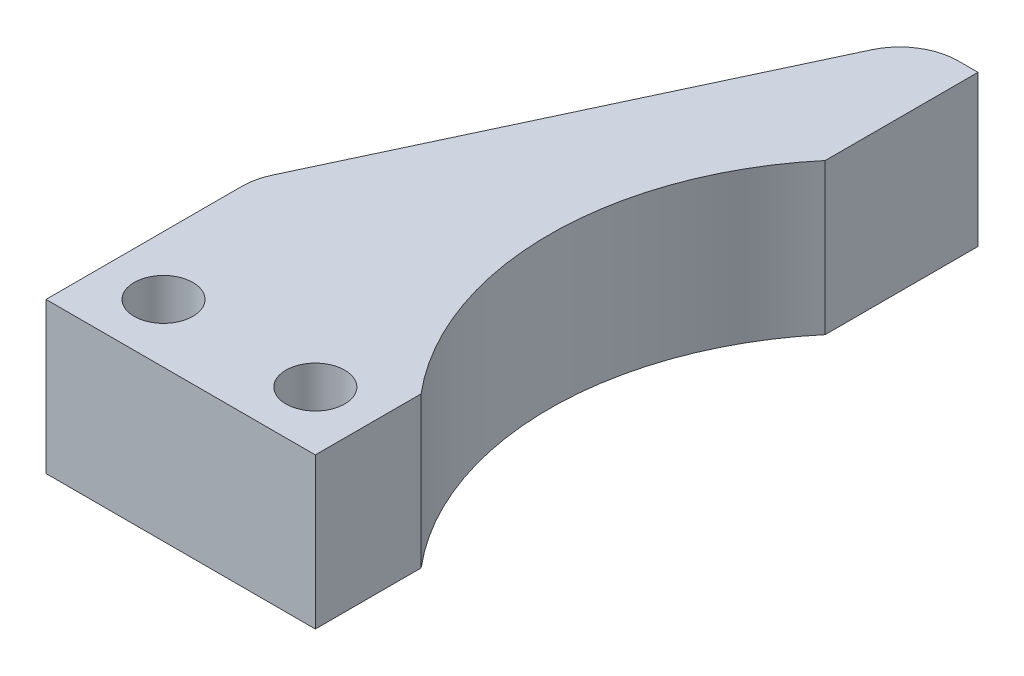
ISO-10303-21;
HEADER;
FILE_DESCRIPTION(('STEP AP214'),'2;1');
FILE_NAME('part.step','',(''),(''),'','','');
FILE_SCHEMA(('AUTOMOTIVE_DESIGN { 1 0 10303 214 1 1 1 1 }'));
ENDSEC;
DATA;
#1=APPLICATION_CONTEXT('core data for automotive mechanical design processes');
#2=APPLICATION_PROTOCOL_DEFINITION('international standard','automotive_design',2000,#1);
#3=PRODUCT_CONTEXT('',#1,'mechanical');
#4=PRODUCT('Part','Part','',(#3));
#5=PRODUCT_RELATED_PRODUCT_CATEGORY('part','',(#4));
#6=PRODUCT_DEFINITION_FORMATION('','',#4);
#7=PRODUCT_DEFINITION_CONTEXT('part definition',#1,'design');
#8=PRODUCT_DEFINITION('design','',#6,#7);
#9=PRODUCT_DEFINITION_SHAPE('','',#8);
#10=(LENGTH_UNIT() NAMED_UNIT(*) SI_UNIT(.MILLI.,.METRE.));
#11=(NAMED_UNIT(*) PLANE_ANGLE_UNIT() SI_UNIT($,.RADIAN.));
#12=(NAMED_UNIT(*) SI_UNIT($,.STERADIAN.) SOLID_ANGLE_UNIT());
#13=UNCERTAINTY_MEASURE_WITH_UNIT(LENGTH_MEASURE(1.E-05),#10,'distance_accuracy_value','');
#14=(GEOMETRIC_REPRESENTATION_CONTEXT(3) GLOBAL_UNCERTAINTY_ASSIGNED_CONTEXT((#13)) GLOBAL_UNIT_ASSIGNED_CONTEXT((#10,
#11,#12)) REPRESENTATION_CONTEXT('',''));
#15=CARTESIAN_POINT('',(0.,0.,0.));
#16=DIRECTION('',(0.,0.,1.));
#17=DIRECTION('',(1.,0.,0.));
#18=AXIS2_PLACEMENT_3D('',#15,#16,#17);
#19=CARTESIAN_POINT('',(-13.3014299379425,3.85,-6.22571671916805));
#20=DIRECTION('',(-0.905702893651664,0.,-0.423913043478261));
#21=DIRECTION('',(-0.423913043478261,0.,0.905702893651664));
#22=AXIS2_PLACEMENT_3D('',#19,#20,#21);
#23=PLANE('',#22);
#24=DIRECTION('',(0.423913043478261,0.,-0.905702893651664));
#25=VECTOR('',#24,1.);
#26=CARTESIAN_POINT('',(-13.3014299379425,-3.85,-6.22571671916805));
#27=LINE('',#26,#25);
#28=CARTESIAN_POINT('',(-13.467108680955,-3.85,-5.87173913043478));
#29=VERTEX_POINT('',#28);
#30=CARTESIAN_POINT('',(-3.71710868095499,-3.85,-26.7029056844231));
#31=VERTEX_POINT('',#30);
#32=EDGE_CURVE('E155',#29,#31,#27,.T.);
#33=ORIENTED_EDGE('',*,*,#32,.F.);
#34=DIRECTION('',(0.,-1.,0.));
#35=VECTOR('',#34,1.);
#36=CARTESIAN_POINT('',(-13.467108680955,3.85,-5.87173913043478));
#37=LINE('',#36,#35);
#38=CARTESIAN_POINT('',(-13.467108680955,3.85,-5.87173913043478));
#39=VERTEX_POINT('',#38);
#40=EDGE_CURVE('E11',#39,#29,#37,.T.);
#41=ORIENTED_EDGE('',*,*,#40,.F.);
#42=DIRECTION('',(0.423913043478261,0.,-0.905702893651664));
#43=VECTOR('',#42,1.);
#44=CARTESIAN_POINT('',(-13.3014299379425,3.85,-6.22571671916805));
#45=LINE('',#44,#43);
#46=CARTESIAN_POINT('',(-3.71710868095499,3.85,-26.7029056844231));
#47=VERTEX_POINT('',#46);
#48=EDGE_CURVE('E193',#39,#47,#45,.T.);
#49=ORIENTED_EDGE('',*,*,#48,.T.);
#50=DIRECTION('',(0.,-1.,0.));
#51=VECTOR('',#50,1.);
#52=CARTESIAN_POINT('',(-3.71710868095499,3.85,-26.7029056844231));
#53=LINE('',#52,#51);
#54=EDGE_CURVE('E60',#47,#31,#53,.T.);
#55=ORIENTED_EDGE('',*,*,#54,.T.);
#56=EDGE_LOOP('',(#33,#41,#49,#55));
#57=FACE_BOUND('',#56,.T.);
#58=ADVANCED_FACE('F43',(#57),#23,.T.);
#59=CARTESIAN_POINT('',(-10.75,3.85,-4.6));
#60=DIRECTION('',(0.,-1.,0.));
#61=DIRECTION('',(0.,0.,-1.));
#62=AXIS2_PLACEMENT_3D('',#59,#60,#61);
#63=CYLINDRICAL_SURFACE('',#62,3.);
#64=CARTESIAN_POINT('',(-10.75,-3.85,-4.6));
#65=DIRECTION('',(0.,1.,0.));
#66=DIRECTION('',(0.,0.,1.));
#67=AXIS2_PLACEMENT_3D('',#64,#65,#66);
#68=CIRCLE('',#67,3.);
#69=CARTESIAN_POINT('',(-13.75,-3.85,-4.6));
#70=VERTEX_POINT('',#69);
#71=EDGE_CURVE('E158',#70,#29,#68,.F.);
#72=ORIENTED_EDGE('',*,*,#71,.F.);
#73=DIRECTION('',(0.,-1.,0.));
#74=VECTOR('',#73,1.);
#75=CARTESIAN_POINT('',(-13.75,3.85,-4.6));
#76=LINE('',#75,#74);
#77=CARTESIAN_POINT('',(-13.75,3.85,-4.6));
#78=VERTEX_POINT('',#77);
#79=EDGE_CURVE('E52',#78,#70,#76,.T.);
#80=ORIENTED_EDGE('',*,*,#79,.F.);
#81=CARTESIAN_POINT('',(-10.75,3.85,-4.6));
#82=DIRECTION('',(0.,1.,0.));
#83=DIRECTION('',(0.,0.,1.));
#84=AXIS2_PLACEMENT_3D('',#81,#82,#83);
#85=CIRCLE('',#84,3.);
#86=EDGE_CURVE('E246',#78,#39,#85,.F.);
#87=ORIENTED_EDGE('',*,*,#86,.T.);
#88=ORIENTED_EDGE('',*,*,#40,.T.);
#89=EDGE_LOOP('',(#72,#80,#87,#88));
#90=FACE_BOUND('',#89,.T.);
#91=ADVANCED_FACE('F221',(#90),#63,.T.);
#92=CARTESIAN_POINT('',(-13.75,3.85,0.));
#93=DIRECTION('',(-1.,0.,0.));
#94=DIRECTION('',(0.,0.,1.));
#95=AXIS2_PLACEMENT_3D('',#92,#93,#94);
#96=PLANE('',#95);
#97=DIRECTION('',(0.,0.,-1.));
#98=VECTOR('',#97,1.);
#99=CARTESIAN_POINT('',(-13.75,-3.85,0.));
#100=LINE('',#99,#98);
#101=CARTESIAN_POINT('',(-13.75,-3.85,5.4));
#102=VERTEX_POINT('',#101);
#103=EDGE_CURVE('E162',#102,#70,#100,.T.);
#104=ORIENTED_EDGE('',*,*,#103,.F.);
#105=DIRECTION('',(0.,-1.,0.));
#106=VECTOR('',#105,1.);
#107=CARTESIAN_POINT('',(-13.75,3.85,5.4));
#108=LINE('',#107,#106);
#109=CARTESIAN_POINT('',(-13.75,3.85,5.4));
#110=VERTEX_POINT('',#109);
#111=EDGE_CURVE('E208',#110,#102,#108,.T.);
#112=ORIENTED_EDGE('',*,*,#111,.F.);
#113=DIRECTION('',(0.,0.,-1.));
#114=VECTOR('',#113,1.);
#115=CARTESIAN_POINT('',(-13.75,3.85,0.));
#116=LINE('',#115,#114);
#117=EDGE_CURVE('E217',#110,#78,#116,.T.);
#118=ORIENTED_EDGE('',*,*,#117,.T.);
#119=ORIENTED_EDGE('',*,*,#79,.T.);
#120=EDGE_LOOP('',(#104,#112,#118,#119));
#121=FACE_BOUND('',#120,.T.);
#122=ADVANCED_FACE('F215',(#121),#96,.T.);
#123=CARTESIAN_POINT('',(0.,3.85,5.4));
#124=DIRECTION('',(0.,0.,-1.));
#125=DIRECTION('',(-1.,0.,0.));
#126=AXIS2_PLACEMENT_3D('',#123,#124,#125);
#127=PLANE('',#126);
#128=DIRECTION('',(1.,0.,0.));
#129=VECTOR('',#128,1.);
#130=CARTESIAN_POINT('',(0.,-3.85,5.4));
#131=LINE('',#130,#129);
#132=CARTESIAN_POINT('',(0.,-3.85,5.4));
#133=VERTEX_POINT('',#132);
#134=EDGE_CURVE('E166',#102,#133,#131,.T.);
#135=ORIENTED_EDGE('',*,*,#134,.T.);
#136=DIRECTION('',(0.,-1.,0.));
#137=VECTOR('',#136,1.);
#138=CARTESIAN_POINT('',(0.,3.85,5.4));
#139=LINE('',#138,#137);
#140=CARTESIAN_POINT('',(0.,3.85,5.4));
#141=VERTEX_POINT('',#140);
#142=EDGE_CURVE('E204',#141,#133,#139,.T.);
#143=ORIENTED_EDGE('',*,*,#142,.F.);
#144=DIRECTION('',(1.,0.,0.));
#145=VECTOR('',#144,1.);
#146=CARTESIAN_POINT('',(0.,3.85,5.4));
#147=LINE('',#146,#145);
#148=EDGE_CURVE('E238',#110,#141,#147,.T.);
#149=ORIENTED_EDGE('',*,*,#148,.F.);
#150=ORIENTED_EDGE('',*,*,#111,.T.);
#151=EDGE_LOOP('',(#135,#143,#149,#150));
#152=FACE_BOUND('',#151,.T.);
#153=ADVANCED_FACE('F230',(#152),#127,.F.);
#154=CARTESIAN_POINT('',(0.,3.85,0.));
#155=DIRECTION('',(-1.,0.,0.));
#156=DIRECTION('',(0.,0.,1.));
#157=AXIS2_PLACEMENT_3D('',#154,#155,#156);
#158=PLANE('',#157);
#159=DIRECTION('',(0.,0.,-1.));
#160=VECTOR('',#159,1.);
#161=CARTESIAN_POINT('',(0.,-3.85,0.));
#162=LINE('',#161,#160);
#163=CARTESIAN_POINT('',(0.,-3.85,0.));
#164=VERTEX_POINT('',#163);
#165=EDGE_CURVE('E169',#133,#164,#162,.T.);
#166=ORIENTED_EDGE('',*,*,#165,.T.);
#167=DIRECTION('',(0.,-1.,0.));
#168=VECTOR('',#167,1.);
#169=CARTESIAN_POINT('',(0.,3.85,0.));
#170=LINE('',#169,#168);
#171=CARTESIAN_POINT('',(0.,3.85,0.));
#172=VERTEX_POINT('',#171);
#173=EDGE_CURVE('E200',#172,#164,#170,.T.);
#174=ORIENTED_EDGE('',*,*,#173,.F.);
#175=DIRECTION('',(0.,0.,-1.));
#176=VECTOR('',#175,1.);
#177=CARTESIAN_POINT('',(0.,3.85,0.));
#178=LINE('',#177,#176);
#179=EDGE_CURVE('E236',#141,#172,#178,.T.);
#180=ORIENTED_EDGE('',*,*,#179,.F.);
#181=ORIENTED_EDGE('',*,*,#142,.T.);
#182=EDGE_LOOP('',(#166,#174,#180,#181));
#183=FACE_BOUND('',#182,.T.);
#184=ADVANCED_FACE('F234',(#183),#158,.F.);
#185=CARTESIAN_POINT('',(12.2306476384286,3.85,-10.3155832769941));
#186=DIRECTION('',(0.,-1.,0.));
#187=DIRECTION('',(0.,0.,-1.));
#188=AXIS2_PLACEMENT_3D('',#185,#186,#187);
#189=CYLINDRICAL_SURFACE('',#188,16.);
#190=CARTESIAN_POINT('',(12.2306476384286,-3.85,-10.3155832769941));
#191=DIRECTION('',(0.,1.,0.));
#192=DIRECTION('',(0.,0.,1.));
#193=AXIS2_PLACEMENT_3D('',#190,#191,#192);
#194=CIRCLE('',#193,16.);
#195=CARTESIAN_POINT('',(0.,-3.85,-20.6311665539883));
#196=VERTEX_POINT('',#195);
#197=EDGE_CURVE('E172',#164,#196,#194,.F.);
#198=ORIENTED_EDGE('',*,*,#197,.T.);
#199=DIRECTION('',(0.,-1.,0.));
#200=VECTOR('',#199,1.);
#201=CARTESIAN_POINT('',(0.,3.85,-20.6311665539883));
#202=LINE('',#201,#200);
#203=CARTESIAN_POINT('',(0.,3.85,-20.6311665539883));
#204=VERTEX_POINT('',#203);
#205=EDGE_CURVE('E126',#204,#196,#202,.T.);
#206=ORIENTED_EDGE('',*,*,#205,.F.);
#207=CARTESIAN_POINT('',(12.2306476384286,3.85,-10.3155832769941));
#208=DIRECTION('',(0.,1.,0.));
#209=DIRECTION('',(0.,0.,1.));
#210=AXIS2_PLACEMENT_3D('',#207,#208,#209);
#211=CIRCLE('',#210,16.);
#212=EDGE_CURVE('E135',#172,#204,#211,.F.);
#213=ORIENTED_EDGE('',*,*,#212,.F.);
#214=ORIENTED_EDGE('',*,*,#173,.T.);
#215=EDGE_LOOP('',(#198,#206,#213,#214));
#216=FACE_BOUND('',#215,.T.);
#217=ADVANCED_FACE('F277',(#216),#189,.F.);
#218=CARTESIAN_POINT('',(0.,3.85,0.));
#219=DIRECTION('',(1.,0.,0.));
#220=DIRECTION('',(0.,0.,-1.));
#221=AXIS2_PLACEMENT_3D('',#218,#219,#220);
#222=PLANE('',#221);
#223=DIRECTION('',(0.,0.,1.));
#224=VECTOR('',#223,1.);
#225=CARTESIAN_POINT('',(0.,-3.85,0.));
#226=LINE('',#225,#224);
#227=CARTESIAN_POINT('',(0.,-3.85,-28.4311665539883));
#228=VERTEX_POINT('',#227);
#229=EDGE_CURVE('E121',#228,#196,#226,.T.);
#230=ORIENTED_EDGE('',*,*,#229,.F.);
#231=DIRECTION('',(0.,-1.,0.));
#232=VECTOR('',#231,1.);
#233=CARTESIAN_POINT('',(0.,3.85,-28.4311665539883));
#234=LINE('',#233,#232);
#235=CARTESIAN_POINT('',(0.,3.85,-28.4311665539883));
#236=VERTEX_POINT('',#235);
#237=EDGE_CURVE('E116',#236,#228,#234,.T.);
#238=ORIENTED_EDGE('',*,*,#237,.F.);
#239=DIRECTION('',(0.,0.,1.));
#240=VECTOR('',#239,1.);
#241=CARTESIAN_POINT('',(0.,3.85,0.));
#242=LINE('',#241,#240);
#243=EDGE_CURVE('E119',#236,#204,#242,.T.);
#244=ORIENTED_EDGE('',*,*,#243,.T.);
#245=ORIENTED_EDGE('',*,*,#205,.T.);
#246=EDGE_LOOP('',(#230,#238,#244,#245));
#247=FACE_BOUND('',#246,.T.);
#248=ADVANCED_FACE('F118',(#247),#222,.T.);
#249=CARTESIAN_POINT('',(0.,3.85,-28.4311665539883));
#250=DIRECTION('',(0.,0.,-1.));
#251=DIRECTION('',(-1.,0.,0.));
#252=AXIS2_PLACEMENT_3D('',#249,#250,#251);
#253=PLANE('',#252);
#254=DIRECTION('',(1.,0.,0.));
#255=VECTOR('',#254,1.);
#256=CARTESIAN_POINT('',(0.,-3.85,-28.4311665539883));
#257=LINE('',#256,#255);
#258=CARTESIAN_POINT('',(-1.,-3.85,-28.4311665539883));
#259=VERTEX_POINT('',#258);
#260=EDGE_CURVE('E178',#259,#228,#257,.T.);
#261=ORIENTED_EDGE('',*,*,#260,.F.);
#262=DIRECTION('',(0.,-1.,0.));
#263=VECTOR('',#262,1.);
#264=CARTESIAN_POINT('',(-1.,3.85,-28.4311665539883));
#265=LINE('',#264,#263);
#266=CARTESIAN_POINT('',(-1.,3.85,-28.4311665539883));
#267=VERTEX_POINT('',#266);
#268=EDGE_CURVE('E88',#267,#259,#265,.T.);
#269=ORIENTED_EDGE('',*,*,#268,.F.);
#270=DIRECTION('',(1.,0.,0.));
#271=VECTOR('',#270,1.);
#272=CARTESIAN_POINT('',(0.,3.85,-28.4311665539883));
#273=LINE('',#272,#271);
#274=EDGE_CURVE('E133',#267,#236,#273,.T.);
#275=ORIENTED_EDGE('',*,*,#274,.T.);
#276=ORIENTED_EDGE('',*,*,#237,.T.);
#277=EDGE_LOOP('',(#261,#269,#275,#276));
#278=FACE_BOUND('',#277,.T.);
#279=ADVANCED_FACE('F139',(#278),#253,.T.);
#280=CARTESIAN_POINT('',(-3.,3.85,2.4));
#281=DIRECTION('',(0.,-1.,0.));
#282=DIRECTION('',(0.,0.,-1.));
#283=AXIS2_PLACEMENT_3D('',#280,#281,#282);
#284=CYLINDRICAL_SURFACE('',#283,1.5);
#285=CARTESIAN_POINT('',(-3.,3.85,2.4));
#286=DIRECTION('',(0.,1.,0.));
#287=DIRECTION('',(0.,0.,1.));
#288=AXIS2_PLACEMENT_3D('',#285,#286,#287);
#289=CIRCLE('',#288,1.5);
#290=CARTESIAN_POINT('',(-3.,3.85,0.900000000000003));
#291=VERTEX_POINT('',#290);
#292=EDGE_CURVE('E144',#291,#291,#289,.F.);
#293=CARTESIAN_POINT('',(-3.,-3.85,2.4));
#294=DIRECTION('',(0.,1.,0.));
#295=DIRECTION('',(0.,0.,1.));
#296=AXIS2_PLACEMENT_3D('',#293,#294,#295);
#297=CIRCLE('',#296,1.5);
#298=CARTESIAN_POINT('',(-3.,-3.85,0.900000000000003));
#299=VERTEX_POINT('',#298);
#300=EDGE_CURVE('E185',#299,#299,#297,.F.);
#301=CARTESIAN_POINT('',(-3.,3.85,0.900000000000003));
#302=CARTESIAN_POINT('',(-3.,3.76979166666667,0.900000000000003));
#303=CARTESIAN_POINT('',(-3.,3.68958333333333,0.900000000000003));
#304=CARTESIAN_POINT('',(-3.,3.52916666666667,0.900000000000003));
#305=CARTESIAN_POINT('',(-3.,3.44895833333333,0.900000000000003));
#306=CARTESIAN_POINT('',(-3.,3.28854166666667,0.900000000000003));
#307=CARTESIAN_POINT('',(-3.,3.20833333333333,0.900000000000003));
#308=CARTESIAN_POINT('',(-3.,3.04791666666667,0.900000000000003));
#309=CARTESIAN_POINT('',(-3.,2.96770833333333,0.900000000000003));
#310=CARTESIAN_POINT('',(-3.,2.80729166666667,0.900000000000003));
#311=CARTESIAN_POINT('',(-3.,2.72708333333333,0.900000000000003));
#312=CARTESIAN_POINT('',(-3.,2.56666666666667,0.900000000000003));
#313=CARTESIAN_POINT('',(-3.,2.48645833333333,0.900000000000003));
#314=CARTESIAN_POINT('',(-3.,2.32604166666667,0.900000000000003));
#315=CARTESIAN_POINT('',(-3.,2.24583333333333,0.900000000000003));
#316=CARTESIAN_POINT('',(-3.,2.08541666666667,0.900000000000003));
#317=CARTESIAN_POINT('',(-3.,2.00520833333333,0.900000000000003));
#318=CARTESIAN_POINT('',(-3.,1.84479166666667,0.900000000000003));
#319=CARTESIAN_POINT('',(-3.,1.76458333333333,0.900000000000003));
#320=CARTESIAN_POINT('',(-3.,1.60416666666667,0.900000000000003));
#321=CARTESIAN_POINT('',(-3.,1.52395833333333,0.900000000000003));
#322=CARTESIAN_POINT('',(-3.,1.36354166666667,0.900000000000003));
#323=CARTESIAN_POINT('',(-3.,1.28333333333333,0.900000000000003));
#324=CARTESIAN_POINT('',(-3.,1.12291666666667,0.900000000000003));
#325=CARTESIAN_POINT('',(-3.,1.04270833333333,0.900000000000003));
#326=CARTESIAN_POINT('',(-3.,0.882291666666667,0.900000000000003));
#327=CARTESIAN_POINT('',(-3.,0.802083333333333,0.900000000000003));
#328=CARTESIAN_POINT('',(-3.,0.641666666666666,0.900000000000003));
#329=CARTESIAN_POINT('',(-3.,0.561458333333333,0.900000000000003));
#330=CARTESIAN_POINT('',(-3.,0.401041666666666,0.900000000000003));
#331=CARTESIAN_POINT('',(-3.,0.320833333333333,0.900000000000003));
#332=CARTESIAN_POINT('',(-3.,0.160416666666666,0.900000000000003));
#333=CARTESIAN_POINT('',(-3.,0.0802083333333329,0.900000000000003));
#334=CARTESIAN_POINT('',(-3.,-0.0802083333333337,0.900000000000003));
#335=CARTESIAN_POINT('',(-3.,-0.160416666666667,0.900000000000003));
#336=CARTESIAN_POINT('',(-3.,-0.320833333333334,0.900000000000003));
#337=CARTESIAN_POINT('',(-3.,-0.401041666666667,0.900000000000003));
#338=CARTESIAN_POINT('',(-3.,-0.561458333333333,0.900000000000003));
#339=CARTESIAN_POINT('',(-3.,-0.641666666666667,0.900000000000003));
#340=CARTESIAN_POINT('',(-3.,-0.802083333333333,0.900000000000003));
#341=CARTESIAN_POINT('',(-3.,-0.882291666666667,0.900000000000003));
#342=CARTESIAN_POINT('',(-3.,-1.04270833333333,0.900000000000003));
#343=CARTESIAN_POINT('',(-3.,-1.12291666666667,0.900000000000003));
#344=CARTESIAN_POINT('',(-3.,-1.28333333333333,0.900000000000003));
#345=CARTESIAN_POINT('',(-3.,-1.36354166666667,0.900000000000003));
#346=CARTESIAN_POINT('',(-3.,-1.52395833333333,0.900000000000003));
#347=CARTESIAN_POINT('',(-3.,-1.60416666666667,0.900000000000003));
#348=CARTESIAN_POINT('',(-3.,-1.76458333333333,0.900000000000003));
#349=CARTESIAN_POINT('',(-3.,-1.84479166666667,0.900000000000003));
#350=CARTESIAN_POINT('',(-3.,-2.00520833333333,0.900000000000003));
#351=CARTESIAN_POINT('',(-3.,-2.08541666666667,0.900000000000003));
#352=CARTESIAN_POINT('',(-3.,-2.24583333333333,0.900000000000003));
#353=CARTESIAN_POINT('',(-3.,-2.32604166666667,0.900000000000003));
#354=CARTESIAN_POINT('',(-3.,-2.48645833333333,0.900000000000003));
#355=CARTESIAN_POINT('',(-3.,-2.56666666666667,0.900000000000003));
#356=CARTESIAN_POINT('',(-3.,-2.72708333333333,0.900000000000003));
#357=CARTESIAN_POINT('',(-3.,-2.80729166666667,0.900000000000003));
#358=CARTESIAN_POINT('',(-3.,-2.96770833333333,0.900000000000003));
#359=CARTESIAN_POINT('',(-3.,-3.04791666666667,0.900000000000003));
#360=CARTESIAN_POINT('',(-3.,-3.20833333333333,0.900000000000003));
#361=CARTESIAN_POINT('',(-3.,-3.28854166666667,0.900000000000003));
#362=CARTESIAN_POINT('',(-3.,-3.44895833333333,0.900000000000003));
#363=CARTESIAN_POINT('',(-3.,-3.52916666666667,0.900000000000003));
#364=CARTESIAN_POINT('',(-3.,-3.68958333333333,0.900000000000003));
#365=CARTESIAN_POINT('',(-3.,-3.76979166666667,0.900000000000003));
#366=CARTESIAN_POINT('',(-3.,-3.85,0.900000000000003));
#367=B_SPLINE_CURVE_WITH_KNOTS('',3,(#301,#302,#303,#304,#305,#306,#307,#308,#309,#310,#311,
#312,#313,#314,#315,#316,#317,#318,#319,#320,#321,#322,#323,#324,#325,#326,#327,#328,#329,#330,
#331,#332,#333,#334,#335,#336,#337,#338,#339,#340,#341,#342,#343,#344,#345,#346,#347,#348,#349,
#350,#351,#352,#353,#354,#355,#356,#357,#358,#359,#360,#361,#362,#363,#364,#365,#366),
.UNSPECIFIED.,.F.,.F.,(4,2,2,2,2,2,2,2,2,2,2,2,2,2,2,2,2,2,2,2,2,2,2,2,2,2,2,2,2,2,2,2,4),(0.,
0.240625,0.48125,0.721875,0.9625,1.203125,1.44375,1.684375,1.925,2.165625,2.40625,2.646875,
2.8875,3.128125,3.36875,3.609375,3.85,4.090625,4.33125,4.571875,4.8125,5.053125,5.29375,
5.534375,5.775,6.015625,6.25625,6.496875,6.7375,6.978125,7.21875,7.459375,7.7),.UNSPECIFIED.);
#368=EDGE_CURVE('BSEAM253',#291,#299,#367,.T.);
#369=ORIENTED_EDGE('',*,*,#292,.F.);
#370=ORIENTED_EDGE('',*,*,#300,.T.);
#371=ORIENTED_EDGE('',*,*,#368,.T.);
#372=ORIENTED_EDGE('',*,*,#368,.F.);
#373=EDGE_LOOP('',(#369,#371,#370,#372));
#374=FACE_BOUND('',#373,.T.);
#375=ADVANCED_FACE('F253',(#374),#284,.F.);
#376=CARTESIAN_POINT('',(-1.,3.85,-25.4311665539883));
#377=DIRECTION('',(0.,-1.,0.));
#378=DIRECTION('',(0.,0.,-1.));
#379=AXIS2_PLACEMENT_3D('',#376,#377,#378);
#380=CYLINDRICAL_SURFACE('',#379,3.);
#381=CARTESIAN_POINT('',(-1.,-3.85,-25.4311665539883));
#382=DIRECTION('',(0.,1.,0.));
#383=DIRECTION('',(0.,0.,1.));
#384=AXIS2_PLACEMENT_3D('',#381,#382,#383);
#385=CIRCLE('',#384,3.);
#386=EDGE_CURVE('E181',#31,#259,#385,.F.);
#387=ORIENTED_EDGE('',*,*,#386,.F.);
#388=ORIENTED_EDGE('',*,*,#54,.F.);
#389=CARTESIAN_POINT('',(-1.,3.85,-25.4311665539883));
#390=DIRECTION('',(0.,1.,0.));
#391=DIRECTION('',(0.,0.,1.));
#392=AXIS2_PLACEMENT_3D('',#389,#390,#391);
#393=CIRCLE('',#392,3.);
#394=EDGE_CURVE('E141',#47,#267,#393,.F.);
#395=ORIENTED_EDGE('',*,*,#394,.T.);
#396=ORIENTED_EDGE('',*,*,#268,.T.);
#397=EDGE_LOOP('',(#387,#388,#395,#396));
#398=FACE_BOUND('',#397,.T.);
#399=ADVANCED_FACE('F250',(#398),#380,.T.);
#400=CARTESIAN_POINT('',(-10.75,3.85,2.4));
#401=DIRECTION('',(0.,-1.,0.));
#402=DIRECTION('',(0.,0.,-1.));
#403=AXIS2_PLACEMENT_3D('',#400,#401,#402);
#404=CYLINDRICAL_SURFACE('',#403,1.5);
#405=CARTESIAN_POINT('',(-10.75,3.85,2.4));
#406=DIRECTION('',(0.,1.,0.));
#407=DIRECTION('',(0.,0.,1.));
#408=AXIS2_PLACEMENT_3D('',#405,#406,#407);
#409=CIRCLE('',#408,1.5);
#410=CARTESIAN_POINT('',(-10.75,3.85,0.900000000000003));
#411=VERTEX_POINT('',#410);
#412=EDGE_CURVE('E151',#411,#411,#409,.T.);
#413=CARTESIAN_POINT('',(-10.75,-3.85,2.4));
#414=DIRECTION('',(0.,1.,0.));
#415=DIRECTION('',(0.,0.,1.));
#416=AXIS2_PLACEMENT_3D('',#413,#414,#415);
#417=CIRCLE('',#416,1.5);
#418=CARTESIAN_POINT('',(-10.75,-3.85,0.900000000000003));
#419=VERTEX_POINT('',#418);
#420=EDGE_CURVE('E189',#419,#419,#417,.T.);
#421=CARTESIAN_POINT('',(-10.75,3.85,0.900000000000003));
#422=CARTESIAN_POINT('',(-10.75,3.76979166666667,0.900000000000003));
#423=CARTESIAN_POINT('',(-10.75,3.68958333333333,0.900000000000003));
#424=CARTESIAN_POINT('',(-10.75,3.52916666666667,0.900000000000003));
#425=CARTESIAN_POINT('',(-10.75,3.44895833333333,0.900000000000003));
#426=CARTESIAN_POINT('',(-10.75,3.28854166666667,0.900000000000003));
#427=CARTESIAN_POINT('',(-10.75,3.20833333333333,0.900000000000003));
#428=CARTESIAN_POINT('',(-10.75,3.04791666666667,0.900000000000003));
#429=CARTESIAN_POINT('',(-10.75,2.96770833333333,0.900000000000003));
#430=CARTESIAN_POINT('',(-10.75,2.80729166666667,0.900000000000003));
#431=CARTESIAN_POINT('',(-10.75,2.72708333333333,0.900000000000003));
#432=CARTESIAN_POINT('',(-10.75,2.56666666666667,0.900000000000003));
#433=CARTESIAN_POINT('',(-10.75,2.48645833333333,0.900000000000003));
#434=CARTESIAN_POINT('',(-10.75,2.32604166666667,0.900000000000003));
#435=CARTESIAN_POINT('',(-10.75,2.24583333333333,0.900000000000003));
#436=CARTESIAN_POINT('',(-10.75,2.08541666666667,0.900000000000003));
#437=CARTESIAN_POINT('',(-10.75,2.00520833333333,0.900000000000003));
#438=CARTESIAN_POINT('',(-10.75,1.84479166666667,0.900000000000003));
#439=CARTESIAN_POINT('',(-10.75,1.76458333333333,0.900000000000003));
#440=CARTESIAN_POINT('',(-10.75,1.60416666666667,0.900000000000003));
#441=CARTESIAN_POINT('',(-10.75,1.52395833333333,0.900000000000003));
#442=CARTESIAN_POINT('',(-10.75,1.36354166666667,0.900000000000003));
#443=CARTESIAN_POINT('',(-10.75,1.28333333333333,0.900000000000003));
#444=CARTESIAN_POINT('',(-10.75,1.12291666666667,0.900000000000003));
#445=CARTESIAN_POINT('',(-10.75,1.04270833333333,0.900000000000003));
#446=CARTESIAN_POINT('',(-10.75,0.882291666666667,0.900000000000003));
#447=CARTESIAN_POINT('',(-10.75,0.802083333333333,0.900000000000003));
#448=CARTESIAN_POINT('',(-10.75,0.641666666666666,0.900000000000003));
#449=CARTESIAN_POINT('',(-10.75,0.561458333333333,0.900000000000003));
#450=CARTESIAN_POINT('',(-10.75,0.401041666666666,0.900000000000003));
#451=CARTESIAN_POINT('',(-10.75,0.320833333333333,0.900000000000003));
#452=CARTESIAN_POINT('',(-10.75,0.160416666666666,0.900000000000003));
#453=CARTESIAN_POINT('',(-10.75,0.0802083333333329,0.900000000000003));
#454=CARTESIAN_POINT('',(-10.75,-0.0802083333333337,0.900000000000003));
#455=CARTESIAN_POINT('',(-10.75,-0.160416666666667,0.900000000000003));
#456=CARTESIAN_POINT('',(-10.75,-0.320833333333334,0.900000000000003));
#457=CARTESIAN_POINT('',(-10.75,-0.401041666666667,0.900000000000003));
#458=CARTESIAN_POINT('',(-10.75,-0.561458333333333,0.900000000000003));
#459=CARTESIAN_POINT('',(-10.75,-0.641666666666667,0.900000000000003));
#460=CARTESIAN_POINT('',(-10.75,-0.802083333333333,0.900000000000003));
#461=CARTESIAN_POINT('',(-10.75,-0.882291666666667,0.900000000000003));
#462=CARTESIAN_POINT('',(-10.75,-1.04270833333333,0.900000000000003));
#463=CARTESIAN_POINT('',(-10.75,-1.12291666666667,0.900000000000003));
#464=CARTESIAN_POINT('',(-10.75,-1.28333333333333,0.900000000000003));
#465=CARTESIAN_POINT('',(-10.75,-1.36354166666667,0.900000000000003));
#466=CARTESIAN_POINT('',(-10.75,-1.52395833333333,0.900000000000003));
#467=CARTESIAN_POINT('',(-10.75,-1.60416666666667,0.900000000000003));
#468=CARTESIAN_POINT('',(-10.75,-1.76458333333333,0.900000000000003));
#469=CARTESIAN_POINT('',(-10.75,-1.84479166666667,0.900000000000003));
#470=CARTESIAN_POINT('',(-10.75,-2.00520833333333,0.900000000000003));
#471=CARTESIAN_POINT('',(-10.75,-2.08541666666667,0.900000000000003));
#472=CARTESIAN_POINT('',(-10.75,-2.24583333333333,0.900000000000003));
#473=CARTESIAN_POINT('',(-10.75,-2.32604166666667,0.900000000000003));
#474=CARTESIAN_POINT('',(-10.75,-2.48645833333333,0.900000000000003));
#475=CARTESIAN_POINT('',(-10.75,-2.56666666666667,0.900000000000003));
#476=CARTESIAN_POINT('',(-10.75,-2.72708333333333,0.900000000000003));
#477=CARTESIAN_POINT('',(-10.75,-2.80729166666667,0.900000000000003));
#478=CARTESIAN_POINT('',(-10.75,-2.96770833333333,0.900000000000003));
#479=CARTESIAN_POINT('',(-10.75,-3.04791666666667,0.900000000000003));
#480=CARTESIAN_POINT('',(-10.75,-3.20833333333333,0.900000000000003));
#481=CARTESIAN_POINT('',(-10.75,-3.28854166666667,0.900000000000003));
#482=CARTESIAN_POINT('',(-10.75,-3.44895833333333,0.900000000000003));
#483=CARTESIAN_POINT('',(-10.75,-3.52916666666667,0.900000000000003));
#484=CARTESIAN_POINT('',(-10.75,-3.68958333333333,0.900000000000003));
#485=CARTESIAN_POINT('',(-10.75,-3.76979166666667,0.900000000000003));
#486=CARTESIAN_POINT('',(-10.75,-3.85,0.900000000000003));
#487=B_SPLINE_CURVE_WITH_KNOTS('',3,(#421,#422,#423,#424,#425,#426,#427,#428,#429,#430,#431,
#432,#433,#434,#435,#436,#437,#438,#439,#440,#441,#442,#443,#444,#445,#446,#447,#448,#449,#450,
#451,#452,#453,#454,#455,#456,#457,#458,#459,#460,#461,#462,#463,#464,#465,#466,#467,#468,#469,
#470,#471,#472,#473,#474,#475,#476,#477,#478,#479,#480,#481,#482,#483,#484,#485,#486),
.UNSPECIFIED.,.F.,.F.,(4,2,2,2,2,2,2,2,2,2,2,2,2,2,2,2,2,2,2,2,2,2,2,2,2,2,2,2,2,2,2,2,4),(0.,
0.240625,0.48125,0.721875,0.9625,1.203125,1.44375,1.684375,1.925,2.165625,2.40625,2.646875,
2.8875,3.128125,3.36875,3.609375,3.85,4.090625,4.33125,4.571875,4.8125,5.053125,5.29375,
5.534375,5.775,6.015625,6.25625,6.496875,6.7375,6.978125,7.21875,7.459375,7.7),.UNSPECIFIED.);
#488=EDGE_CURVE('BSEAM252',#411,#419,#487,.T.);
#489=ORIENTED_EDGE('',*,*,#412,.T.);
#490=ORIENTED_EDGE('',*,*,#420,.F.);
#491=ORIENTED_EDGE('',*,*,#488,.T.);
#492=ORIENTED_EDGE('',*,*,#488,.F.);
#493=EDGE_LOOP('',(#489,#491,#490,#492));
#494=FACE_BOUND('',#493,.T.);
#495=ADVANCED_FACE('F252',(#494),#404,.F.);
#496=CARTESIAN_POINT('',(0.,3.85,0.));
#497=DIRECTION('',(0.,1.,0.));
#498=DIRECTION('',(0.,0.,1.));
#499=AXIS2_PLACEMENT_3D('',#496,#497,#498);
#500=PLANE('',#499);
#501=ORIENTED_EDGE('',*,*,#48,.F.);
#502=ORIENTED_EDGE('',*,*,#86,.F.);
#503=ORIENTED_EDGE('',*,*,#117,.F.);
#504=ORIENTED_EDGE('',*,*,#148,.T.);
#505=ORIENTED_EDGE('',*,*,#179,.T.);
#506=ORIENTED_EDGE('',*,*,#212,.T.);
#507=ORIENTED_EDGE('',*,*,#243,.F.);
#508=ORIENTED_EDGE('',*,*,#274,.F.);
#509=ORIENTED_EDGE('',*,*,#394,.F.);
#510=EDGE_LOOP('',(#501,#502,#503,#504,#505,#506,#507,#508,#509));
#511=FACE_BOUND('',#510,.T.);
#512=ORIENTED_EDGE('',*,*,#292,.T.);
#513=EDGE_LOOP('',(#512));
#514=FACE_BOUND('',#513,.T.);
#515=ORIENTED_EDGE('',*,*,#412,.F.);
#516=EDGE_LOOP('',(#515));
#517=FACE_BOUND('',#516,.T.);
#518=ADVANCED_FACE('F130',(#511,#514,#517),#500,.T.);
#519=CARTESIAN_POINT('',(0.,-3.85,0.));
#520=DIRECTION('',(0.,1.,0.));
#521=DIRECTION('',(0.,0.,1.));
#522=AXIS2_PLACEMENT_3D('',#519,#520,#521);
#523=PLANE('',#522);
#524=ORIENTED_EDGE('',*,*,#32,.T.);
#525=ORIENTED_EDGE('',*,*,#386,.T.);
#526=ORIENTED_EDGE('',*,*,#260,.T.);
#527=ORIENTED_EDGE('',*,*,#229,.T.);
#528=ORIENTED_EDGE('',*,*,#197,.F.);
#529=ORIENTED_EDGE('',*,*,#165,.F.);
#530=ORIENTED_EDGE('',*,*,#134,.F.);
#531=ORIENTED_EDGE('',*,*,#103,.T.);
#532=ORIENTED_EDGE('',*,*,#71,.T.);
#533=EDGE_LOOP('',(#524,#525,#526,#527,#528,#529,#530,#531,#532));
#534=FACE_BOUND('',#533,.T.);
#535=ORIENTED_EDGE('',*,*,#300,.F.);
#536=EDGE_LOOP('',(#535));
#537=FACE_BOUND('',#536,.T.);
#538=ORIENTED_EDGE('',*,*,#420,.T.);
#539=EDGE_LOOP('',(#538));
#540=FACE_BOUND('',#539,.T.);
#541=ADVANCED_FACE('F224',(#534,#537,#540),#523,.F.);
#542=CLOSED_SHELL('',(#58,#91,#122,#153,#184,#217,#248,#279,#375,#399,#495,#518,#541));
#543=MANIFOLD_SOLID_BREP('B2',#542);
#544=ADVANCED_BREP_SHAPE_REPRESENTATION('',(#18,#543),#14);
#545=SHAPE_DEFINITION_REPRESENTATION(#9,#544);
ENDSEC;
END-ISO-10303-21;
